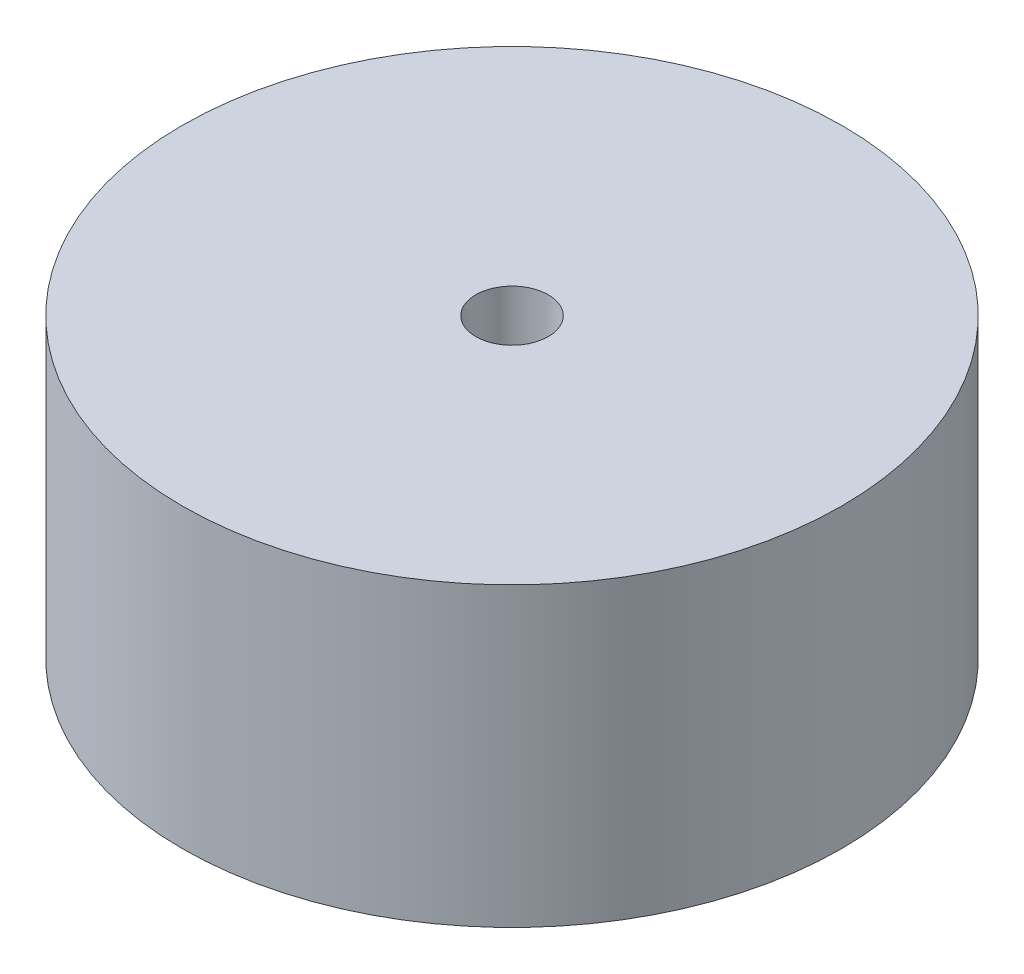
ISO-10303-21;
HEADER;
FILE_DESCRIPTION(('STEP AP214'),'2;1');
FILE_NAME('part.step','',(''),(''),'','','');
FILE_SCHEMA(('AUTOMOTIVE_DESIGN { 1 0 10303 214 1 1 1 1 }'));
ENDSEC;
DATA;
#1=APPLICATION_CONTEXT('core data for automotive mechanical design processes');
#2=APPLICATION_PROTOCOL_DEFINITION('international standard','automotive_design',2000,#1);
#3=PRODUCT_CONTEXT('',#1,'mechanical');
#4=PRODUCT('Part','Part','',(#3));
#5=PRODUCT_RELATED_PRODUCT_CATEGORY('part','',(#4));
#6=PRODUCT_DEFINITION_FORMATION('','',#4);
#7=PRODUCT_DEFINITION_CONTEXT('part definition',#1,'design');
#8=PRODUCT_DEFINITION('design','',#6,#7);
#9=PRODUCT_DEFINITION_SHAPE('','',#8);
#10=(LENGTH_UNIT() NAMED_UNIT(*) SI_UNIT(.MILLI.,.METRE.));
#11=(NAMED_UNIT(*) PLANE_ANGLE_UNIT() SI_UNIT($,.RADIAN.));
#12=(NAMED_UNIT(*) SI_UNIT($,.STERADIAN.) SOLID_ANGLE_UNIT());
#13=UNCERTAINTY_MEASURE_WITH_UNIT(LENGTH_MEASURE(1.E-05),#10,'distance_accuracy_value','');
#14=(GEOMETRIC_REPRESENTATION_CONTEXT(3) GLOBAL_UNCERTAINTY_ASSIGNED_CONTEXT((#13)) GLOBAL_UNIT_ASSIGNED_CONTEXT((#10,
#11,#12)) REPRESENTATION_CONTEXT('',''));
#15=CARTESIAN_POINT('',(0.,0.,0.));
#16=DIRECTION('',(0.,0.,1.));
#17=DIRECTION('',(1.,0.,0.));
#18=AXIS2_PLACEMENT_3D('',#15,#16,#17);
#19=CARTESIAN_POINT('',(0.,45.,0.));
#20=DIRECTION('',(0.,-1.,0.));
#21=DIRECTION('',(0.,0.,-1.));
#22=AXIS2_PLACEMENT_3D('',#19,#20,#21);
#23=CYLINDRICAL_SURFACE('',#22,50.);
#24=CARTESIAN_POINT('',(0.,45.,0.));
#25=DIRECTION('',(0.,1.,0.));
#26=DIRECTION('',(0.,0.,1.));
#27=AXIS2_PLACEMENT_3D('',#24,#25,#26);
#28=CIRCLE('',#27,50.);
#29=CARTESIAN_POINT('',(0.,45.,50.));
#30=VERTEX_POINT('',#29);
#31=EDGE_CURVE('E9',#30,#30,#28,.T.);
#32=ORIENTED_EDGE('',*,*,#31,.F.);
#33=EDGE_LOOP('',(#32));
#34=FACE_BOUND('',#33,.T.);
#35=CARTESIAN_POINT('',(0.,0.,0.));
#36=DIRECTION('',(0.,1.,0.));
#37=DIRECTION('',(0.,0.,1.));
#38=AXIS2_PLACEMENT_3D('',#35,#36,#37);
#39=CIRCLE('',#38,50.);
#40=CARTESIAN_POINT('',(0.,0.,50.));
#41=VERTEX_POINT('',#40);
#42=EDGE_CURVE('E17',#41,#41,#39,.T.);
#43=ORIENTED_EDGE('',*,*,#42,.T.);
#44=EDGE_LOOP('',(#43));
#45=FACE_BOUND('',#44,.T.);
#46=ADVANCED_FACE('F14',(#34,#45),#23,.T.);
#47=CARTESIAN_POINT('',(0.,45.,0.));
#48=DIRECTION('',(0.,1.,0.));
#49=DIRECTION('',(0.,0.,1.));
#50=AXIS2_PLACEMENT_3D('',#47,#48,#49);
#51=PLANE('',#50);
#52=CARTESIAN_POINT('',(0.,45.,0.));
#53=DIRECTION('',(0.,1.,0.));
#54=DIRECTION('',(0.,0.,1.));
#55=AXIS2_PLACEMENT_3D('',#52,#53,#54);
#56=CIRCLE('',#55,5.5);
#57=CARTESIAN_POINT('',(0.,45.,5.5));
#58=VERTEX_POINT('',#57);
#59=EDGE_CURVE('E32',#58,#58,#56,.T.);
#60=ORIENTED_EDGE('',*,*,#59,.F.);
#61=EDGE_LOOP('',(#60));
#62=FACE_BOUND('',#61,.T.);
#63=ORIENTED_EDGE('',*,*,#31,.T.);
#64=EDGE_LOOP('',(#63));
#65=FACE_BOUND('',#64,.T.);
#66=ADVANCED_FACE('F39',(#62,#65),#51,.T.);
#67=CARTESIAN_POINT('',(0.,0.,0.));
#68=DIRECTION('',(0.,1.,0.));
#69=DIRECTION('',(0.,0.,1.));
#70=AXIS2_PLACEMENT_3D('',#67,#68,#69);
#71=PLANE('',#70);
#72=CARTESIAN_POINT('',(0.,0.,0.));
#73=DIRECTION('',(0.,1.,0.));
#74=DIRECTION('',(0.,0.,1.));
#75=AXIS2_PLACEMENT_3D('',#72,#73,#74);
#76=CIRCLE('',#75,5.5);
#77=CARTESIAN_POINT('',(0.,0.,5.5));
#78=VERTEX_POINT('',#77);
#79=EDGE_CURVE('E27',#78,#78,#76,.T.);
#80=ORIENTED_EDGE('',*,*,#79,.T.);
#81=EDGE_LOOP('',(#80));
#82=FACE_BOUND('',#81,.T.);
#83=ORIENTED_EDGE('',*,*,#42,.F.);
#84=EDGE_LOOP('',(#83));
#85=FACE_BOUND('',#84,.T.);
#86=ADVANCED_FACE('F41',(#82,#85),#71,.F.);
#87=CARTESIAN_POINT('',(0.,45.,0.));
#88=DIRECTION('',(0.,1.,0.));
#89=DIRECTION('',(0.,0.,1.));
#90=AXIS2_PLACEMENT_3D('',#87,#88,#89);
#91=CYLINDRICAL_SURFACE('',#90,5.5);
#92=ORIENTED_EDGE('',*,*,#79,.F.);
#93=EDGE_LOOP('',(#92));
#94=FACE_BOUND('',#93,.T.);
#95=ORIENTED_EDGE('',*,*,#59,.T.);
#96=EDGE_LOOP('',(#95));
#97=FACE_BOUND('',#96,.T.);
#98=ADVANCED_FACE('F37',(#94,#97),#91,.F.);
#99=CLOSED_SHELL('',(#46,#66,#86,#98));
#100=MANIFOLD_SOLID_BREP('B1',#99);
#101=ADVANCED_BREP_SHAPE_REPRESENTATION('',(#18,#100),#14);
#102=SHAPE_DEFINITION_REPRESENTATION(#9,#101);
ENDSEC;
END-ISO-10303-21;
